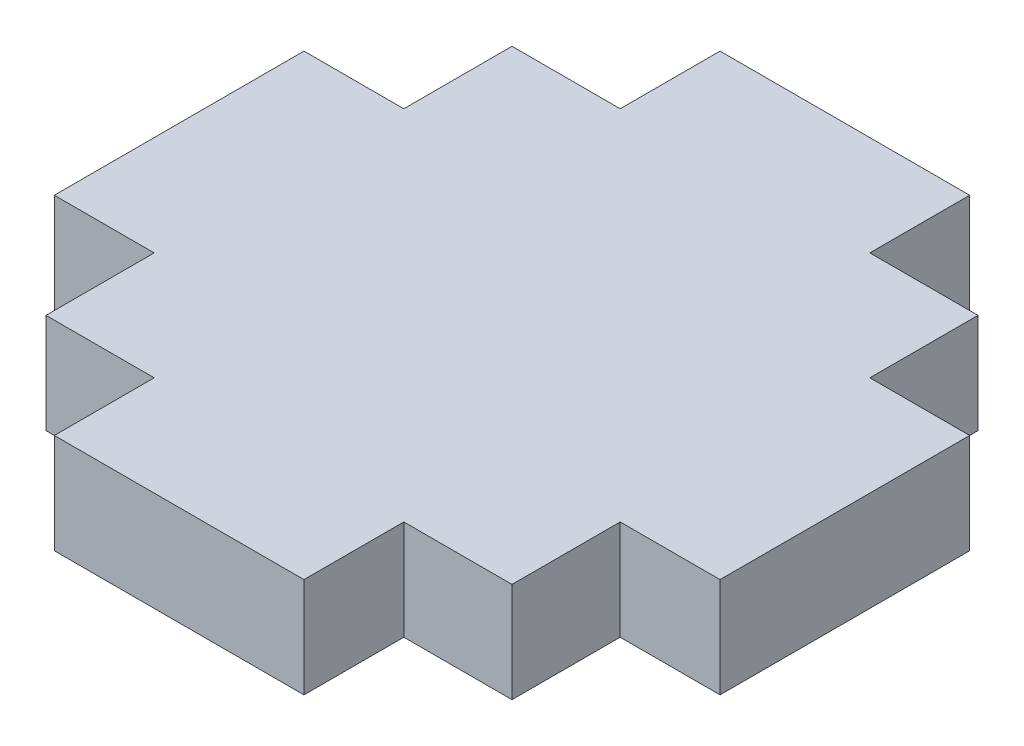
ISO-10303-21;
HEADER;
FILE_DESCRIPTION(('STEP AP214'),'2;1');
FILE_NAME('part.step','',(''),(''),'','','');
FILE_SCHEMA(('AUTOMOTIVE_DESIGN { 1 0 10303 214 1 1 1 1 }'));
ENDSEC;
DATA;
#1=APPLICATION_CONTEXT('core data for automotive mechanical design processes');
#2=APPLICATION_PROTOCOL_DEFINITION('international standard','automotive_design',2000,#1);
#3=PRODUCT_CONTEXT('',#1,'mechanical');
#4=PRODUCT('Part','Part','',(#3));
#5=PRODUCT_RELATED_PRODUCT_CATEGORY('part','',(#4));
#6=PRODUCT_DEFINITION_FORMATION('','',#4);
#7=PRODUCT_DEFINITION_CONTEXT('part definition',#1,'design');
#8=PRODUCT_DEFINITION('design','',#6,#7);
#9=PRODUCT_DEFINITION_SHAPE('','',#8);
#10=(LENGTH_UNIT() NAMED_UNIT(*) SI_UNIT(.MILLI.,.METRE.));
#11=(NAMED_UNIT(*) PLANE_ANGLE_UNIT() SI_UNIT($,.RADIAN.));
#12=(NAMED_UNIT(*) SI_UNIT($,.STERADIAN.) SOLID_ANGLE_UNIT());
#13=UNCERTAINTY_MEASURE_WITH_UNIT(LENGTH_MEASURE(1.E-05),#10,'distance_accuracy_value','');
#14=(GEOMETRIC_REPRESENTATION_CONTEXT(3) GLOBAL_UNCERTAINTY_ASSIGNED_CONTEXT((#13)) GLOBAL_UNIT_ASSIGNED_CONTEXT((#10,
#11,#12)) REPRESENTATION_CONTEXT('',''));
#15=CARTESIAN_POINT('',(0.,0.,0.));
#16=DIRECTION('',(0.,0.,1.));
#17=DIRECTION('',(1.,0.,0.));
#18=AXIS2_PLACEMENT_3D('',#15,#16,#17);
#19=CARTESIAN_POINT('',(27.5,6.,0.));
#20=DIRECTION('',(-1.,0.,0.));
#21=DIRECTION('',(0.,0.,1.));
#22=AXIS2_PLACEMENT_3D('',#19,#20,#21);
#23=PLANE('',#22);
#24=DIRECTION('',(0.,0.,-1.));
#25=VECTOR('',#24,1.);
#26=CARTESIAN_POINT('',(27.5,0.,0.));
#27=LINE('',#26,#25);
#28=CARTESIAN_POINT('',(27.5,0.,0.));
#29=VERTEX_POINT('',#28);
#30=CARTESIAN_POINT('',(27.5,0.,-5.99999999999999));
#31=VERTEX_POINT('',#30);
#32=EDGE_CURVE('E213',#29,#31,#27,.T.);
#33=ORIENTED_EDGE('',*,*,#32,.T.);
#34=DIRECTION('',(0.,-1.,0.));
#35=VECTOR('',#34,1.);
#36=CARTESIAN_POINT('',(27.5,6.,-5.99999999999999));
#37=LINE('',#36,#35);
#38=CARTESIAN_POINT('',(27.5,6.,-5.99999999999999));
#39=VERTEX_POINT('',#38);
#40=EDGE_CURVE('E11',#39,#31,#37,.T.);
#41=ORIENTED_EDGE('',*,*,#40,.F.);
#42=DIRECTION('',(0.,0.,-1.));
#43=VECTOR('',#42,1.);
#44=CARTESIAN_POINT('',(27.5,6.,0.));
#45=LINE('',#44,#43);
#46=CARTESIAN_POINT('',(27.5,6.,0.));
#47=VERTEX_POINT('',#46);
#48=EDGE_CURVE('E282',#47,#39,#45,.T.);
#49=ORIENTED_EDGE('',*,*,#48,.F.);
#50=DIRECTION('',(0.,-1.,0.));
#51=VECTOR('',#50,1.);
#52=CARTESIAN_POINT('',(27.5,6.,0.));
#53=LINE('',#52,#51);
#54=EDGE_CURVE('E209',#47,#29,#53,.T.);
#55=ORIENTED_EDGE('',*,*,#54,.T.);
#56=EDGE_LOOP('',(#33,#41,#49,#55));
#57=FACE_BOUND('',#56,.T.);
#58=ADVANCED_FACE('F41',(#57),#23,.F.);
#59=CARTESIAN_POINT('',(0.,6.,-5.99999999999996));
#60=DIRECTION('',(0.,0.,-1.));
#61=DIRECTION('',(-1.,0.,0.));
#62=AXIS2_PLACEMENT_3D('',#59,#60,#61);
#63=PLANE('',#62);
#64=DIRECTION('',(1.,0.,0.));
#65=VECTOR('',#64,1.);
#66=CARTESIAN_POINT('',(0.,0.,-5.99999999999996));
#67=LINE('',#66,#65);
#68=CARTESIAN_POINT('',(34.,0.,-6.));
#69=VERTEX_POINT('',#68);
#70=EDGE_CURVE('E217',#31,#69,#67,.T.);
#71=ORIENTED_EDGE('',*,*,#70,.T.);
#72=DIRECTION('',(0.,-1.,0.));
#73=VECTOR('',#72,1.);
#74=CARTESIAN_POINT('',(34.,6.,-6.));
#75=LINE('',#74,#73);
#76=CARTESIAN_POINT('',(34.,6.,-6.));
#77=VERTEX_POINT('',#76);
#78=EDGE_CURVE('E50',#77,#69,#75,.T.);
#79=ORIENTED_EDGE('',*,*,#78,.F.);
#80=DIRECTION('',(1.,0.,0.));
#81=VECTOR('',#80,1.);
#82=CARTESIAN_POINT('',(0.,6.,-5.99999999999996));
#83=LINE('',#82,#81);
#84=EDGE_CURVE('E133',#39,#77,#83,.T.);
#85=ORIENTED_EDGE('',*,*,#84,.F.);
#86=ORIENTED_EDGE('',*,*,#40,.T.);
#87=EDGE_LOOP('',(#71,#79,#85,#86));
#88=FACE_BOUND('',#87,.T.);
#89=ADVANCED_FACE('F423',(#88),#63,.F.);
#90=CARTESIAN_POINT('',(34.,6.,0.));
#91=DIRECTION('',(-1.,0.,0.));
#92=DIRECTION('',(0.,0.,1.));
#93=AXIS2_PLACEMENT_3D('',#90,#91,#92);
#94=PLANE('',#93);
#95=DIRECTION('',(0.,0.,-1.));
#96=VECTOR('',#95,1.);
#97=CARTESIAN_POINT('',(34.,0.,0.));
#98=LINE('',#97,#96);
#99=CARTESIAN_POINT('',(34.,0.,-12.5));
#100=VERTEX_POINT('',#99);
#101=EDGE_CURVE('E220',#69,#100,#98,.T.);
#102=ORIENTED_EDGE('',*,*,#101,.T.);
#103=DIRECTION('',(0.,-1.,0.));
#104=VECTOR('',#103,1.);
#105=CARTESIAN_POINT('',(34.,6.,-12.5));
#106=LINE('',#105,#104);
#107=CARTESIAN_POINT('',(34.,6.,-12.5));
#108=VERTEX_POINT('',#107);
#109=EDGE_CURVE('E332',#108,#100,#106,.T.);
#110=ORIENTED_EDGE('',*,*,#109,.F.);
#111=DIRECTION('',(0.,0.,-1.));
#112=VECTOR('',#111,1.);
#113=CARTESIAN_POINT('',(34.,6.,0.));
#114=LINE('',#113,#112);
#115=EDGE_CURVE('E342',#77,#108,#114,.T.);
#116=ORIENTED_EDGE('',*,*,#115,.F.);
#117=ORIENTED_EDGE('',*,*,#78,.T.);
#118=EDGE_LOOP('',(#102,#110,#116,#117));
#119=FACE_BOUND('',#118,.T.);
#120=ADVANCED_FACE('F340',(#119),#94,.F.);
#121=CARTESIAN_POINT('',(0.,6.,-12.5));
#122=DIRECTION('',(0.,0.,-1.));
#123=DIRECTION('',(-1.,0.,0.));
#124=AXIS2_PLACEMENT_3D('',#121,#122,#123);
#125=PLANE('',#124);
#126=DIRECTION('',(1.,0.,0.));
#127=VECTOR('',#126,1.);
#128=CARTESIAN_POINT('',(0.,0.,-12.5));
#129=LINE('',#128,#127);
#130=CARTESIAN_POINT('',(40.,0.,-12.5));
#131=VERTEX_POINT('',#130);
#132=EDGE_CURVE('E223',#100,#131,#129,.T.);
#133=ORIENTED_EDGE('',*,*,#132,.T.);
#134=DIRECTION('',(0.,-1.,0.));
#135=VECTOR('',#134,1.);
#136=CARTESIAN_POINT('',(40.,6.,-12.5));
#137=LINE('',#136,#135);
#138=CARTESIAN_POINT('',(40.,6.,-12.5));
#139=VERTEX_POINT('',#138);
#140=EDGE_CURVE('E328',#139,#131,#137,.T.);
#141=ORIENTED_EDGE('',*,*,#140,.F.);
#142=DIRECTION('',(1.,0.,0.));
#143=VECTOR('',#142,1.);
#144=CARTESIAN_POINT('',(0.,6.,-12.5));
#145=LINE('',#144,#143);
#146=EDGE_CURVE('E361',#108,#139,#145,.T.);
#147=ORIENTED_EDGE('',*,*,#146,.F.);
#148=ORIENTED_EDGE('',*,*,#109,.T.);
#149=EDGE_LOOP('',(#133,#141,#147,#148));
#150=FACE_BOUND('',#149,.T.);
#151=ADVANCED_FACE('F350',(#150),#125,.F.);
#152=CARTESIAN_POINT('',(40.,6.,0.));
#153=DIRECTION('',(-1.,0.,0.));
#154=DIRECTION('',(0.,0.,1.));
#155=AXIS2_PLACEMENT_3D('',#152,#153,#154);
#156=PLANE('',#155);
#157=DIRECTION('',(0.,0.,-1.));
#158=VECTOR('',#157,1.);
#159=CARTESIAN_POINT('',(40.,0.,0.));
#160=LINE('',#159,#158);
#161=CARTESIAN_POINT('',(40.,0.,-27.5));
#162=VERTEX_POINT('',#161);
#163=EDGE_CURVE('E226',#131,#162,#160,.T.);
#164=ORIENTED_EDGE('',*,*,#163,.T.);
#165=DIRECTION('',(0.,-1.,0.));
#166=VECTOR('',#165,1.);
#167=CARTESIAN_POINT('',(40.,6.,-27.5));
#168=LINE('',#167,#166);
#169=CARTESIAN_POINT('',(40.,6.,-27.5));
#170=VERTEX_POINT('',#169);
#171=EDGE_CURVE('E325',#170,#162,#168,.T.);
#172=ORIENTED_EDGE('',*,*,#171,.F.);
#173=DIRECTION('',(0.,0.,-1.));
#174=VECTOR('',#173,1.);
#175=CARTESIAN_POINT('',(40.,6.,0.));
#176=LINE('',#175,#174);
#177=EDGE_CURVE('E356',#139,#170,#176,.T.);
#178=ORIENTED_EDGE('',*,*,#177,.F.);
#179=ORIENTED_EDGE('',*,*,#140,.T.);
#180=EDGE_LOOP('',(#164,#172,#178,#179));
#181=FACE_BOUND('',#180,.T.);
#182=ADVANCED_FACE('F354',(#181),#156,.F.);
#183=CARTESIAN_POINT('',(0.,6.,-27.5));
#184=DIRECTION('',(0.,0.,-1.));
#185=DIRECTION('',(-1.,0.,0.));
#186=AXIS2_PLACEMENT_3D('',#183,#184,#185);
#187=PLANE('',#186);
#188=DIRECTION('',(1.,0.,0.));
#189=VECTOR('',#188,1.);
#190=CARTESIAN_POINT('',(0.,0.,-27.5));
#191=LINE('',#190,#189);
#192=CARTESIAN_POINT('',(34.,0.,-27.5));
#193=VERTEX_POINT('',#192);
#194=EDGE_CURVE('E230',#193,#162,#191,.T.);
#195=ORIENTED_EDGE('',*,*,#194,.F.);
#196=DIRECTION('',(0.,-1.,0.));
#197=VECTOR('',#196,1.);
#198=CARTESIAN_POINT('',(34.,6.,-27.5));
#199=LINE('',#198,#197);
#200=CARTESIAN_POINT('',(34.,6.,-27.5));
#201=VERTEX_POINT('',#200);
#202=EDGE_CURVE('E322',#201,#193,#199,.T.);
#203=ORIENTED_EDGE('',*,*,#202,.F.);
#204=DIRECTION('',(1.,0.,0.));
#205=VECTOR('',#204,1.);
#206=CARTESIAN_POINT('',(0.,6.,-27.5));
#207=LINE('',#206,#205);
#208=EDGE_CURVE('E360',#201,#170,#207,.T.);
#209=ORIENTED_EDGE('',*,*,#208,.T.);
#210=ORIENTED_EDGE('',*,*,#171,.T.);
#211=EDGE_LOOP('',(#195,#203,#209,#210));
#212=FACE_BOUND('',#211,.T.);
#213=ADVANCED_FACE('F436',(#212),#187,.T.);
#214=CARTESIAN_POINT('',(34.,6.,0.));
#215=DIRECTION('',(1.,0.,0.));
#216=DIRECTION('',(0.,0.,-1.));
#217=AXIS2_PLACEMENT_3D('',#214,#215,#216);
#218=PLANE('',#217);
#219=DIRECTION('',(0.,0.,1.));
#220=VECTOR('',#219,1.);
#221=CARTESIAN_POINT('',(34.,0.,0.));
#222=LINE('',#221,#220);
#223=CARTESIAN_POINT('',(34.,0.,-34.));
#224=VERTEX_POINT('',#223);
#225=EDGE_CURVE('E234',#224,#193,#222,.T.);
#226=ORIENTED_EDGE('',*,*,#225,.F.);
#227=DIRECTION('',(0.,-1.,0.));
#228=VECTOR('',#227,1.);
#229=CARTESIAN_POINT('',(34.,6.,-34.));
#230=LINE('',#229,#228);
#231=CARTESIAN_POINT('',(34.,6.,-34.));
#232=VERTEX_POINT('',#231);
#233=EDGE_CURVE('E319',#232,#224,#230,.T.);
#234=ORIENTED_EDGE('',*,*,#233,.F.);
#235=DIRECTION('',(0.,0.,1.));
#236=VECTOR('',#235,1.);
#237=CARTESIAN_POINT('',(34.,6.,0.));
#238=LINE('',#237,#236);
#239=EDGE_CURVE('E365',#232,#201,#238,.T.);
#240=ORIENTED_EDGE('',*,*,#239,.T.);
#241=ORIENTED_EDGE('',*,*,#202,.T.);
#242=EDGE_LOOP('',(#226,#234,#240,#241));
#243=FACE_BOUND('',#242,.T.);
#244=ADVANCED_FACE('F439',(#243),#218,.T.);
#245=CARTESIAN_POINT('',(0.,6.,-34.));
#246=DIRECTION('',(0.,0.,-1.));
#247=DIRECTION('',(-1.,0.,0.));
#248=AXIS2_PLACEMENT_3D('',#245,#246,#247);
#249=PLANE('',#248);
#250=DIRECTION('',(1.,0.,0.));
#251=VECTOR('',#250,1.);
#252=CARTESIAN_POINT('',(0.,0.,-34.));
#253=LINE('',#252,#251);
#254=CARTESIAN_POINT('',(27.5,0.,-34.));
#255=VERTEX_POINT('',#254);
#256=EDGE_CURVE('E238',#255,#224,#253,.T.);
#257=ORIENTED_EDGE('',*,*,#256,.F.);
#258=DIRECTION('',(0.,-1.,0.));
#259=VECTOR('',#258,1.);
#260=CARTESIAN_POINT('',(27.5,6.,-34.));
#261=LINE('',#260,#259);
#262=CARTESIAN_POINT('',(27.5,6.,-34.));
#263=VERTEX_POINT('',#262);
#264=EDGE_CURVE('E316',#263,#255,#261,.T.);
#265=ORIENTED_EDGE('',*,*,#264,.F.);
#266=DIRECTION('',(1.,0.,0.));
#267=VECTOR('',#266,1.);
#268=CARTESIAN_POINT('',(0.,6.,-34.));
#269=LINE('',#268,#267);
#270=EDGE_CURVE('E373',#263,#232,#269,.T.);
#271=ORIENTED_EDGE('',*,*,#270,.T.);
#272=ORIENTED_EDGE('',*,*,#233,.T.);
#273=EDGE_LOOP('',(#257,#265,#271,#272));
#274=FACE_BOUND('',#273,.T.);
#275=ADVANCED_FACE('F443',(#274),#249,.T.);
#276=CARTESIAN_POINT('',(27.5,6.,0.));
#277=DIRECTION('',(1.,0.,0.));
#278=DIRECTION('',(0.,0.,-1.));
#279=AXIS2_PLACEMENT_3D('',#276,#277,#278);
#280=PLANE('',#279);
#281=DIRECTION('',(0.,0.,1.));
#282=VECTOR('',#281,1.);
#283=CARTESIAN_POINT('',(27.5,0.,0.));
#284=LINE('',#283,#282);
#285=CARTESIAN_POINT('',(27.5,0.,-40.));
#286=VERTEX_POINT('',#285);
#287=EDGE_CURVE('E242',#286,#255,#284,.T.);
#288=ORIENTED_EDGE('',*,*,#287,.F.);
#289=DIRECTION('',(0.,-1.,0.));
#290=VECTOR('',#289,1.);
#291=CARTESIAN_POINT('',(27.5,6.,-40.));
#292=LINE('',#291,#290);
#293=CARTESIAN_POINT('',(27.5,6.,-40.));
#294=VERTEX_POINT('',#293);
#295=EDGE_CURVE('E313',#294,#286,#292,.T.);
#296=ORIENTED_EDGE('',*,*,#295,.F.);
#297=DIRECTION('',(0.,0.,1.));
#298=VECTOR('',#297,1.);
#299=CARTESIAN_POINT('',(27.5,6.,0.));
#300=LINE('',#299,#298);
#301=EDGE_CURVE('E377',#294,#263,#300,.T.);
#302=ORIENTED_EDGE('',*,*,#301,.T.);
#303=ORIENTED_EDGE('',*,*,#264,.T.);
#304=EDGE_LOOP('',(#288,#296,#302,#303));
#305=FACE_BOUND('',#304,.T.);
#306=ADVANCED_FACE('F447',(#305),#280,.T.);
#307=CARTESIAN_POINT('',(0.,6.,-40.));
#308=DIRECTION('',(0.,0.,-1.));
#309=DIRECTION('',(-1.,0.,0.));
#310=AXIS2_PLACEMENT_3D('',#307,#308,#309);
#311=PLANE('',#310);
#312=DIRECTION('',(1.,0.,0.));
#313=VECTOR('',#312,1.);
#314=CARTESIAN_POINT('',(0.,0.,-40.));
#315=LINE('',#314,#313);
#316=CARTESIAN_POINT('',(12.5,0.,-40.));
#317=VERTEX_POINT('',#316);
#318=EDGE_CURVE('E246',#317,#286,#315,.T.);
#319=ORIENTED_EDGE('',*,*,#318,.F.);
#320=DIRECTION('',(0.,-1.,0.));
#321=VECTOR('',#320,1.);
#322=CARTESIAN_POINT('',(12.5,6.,-40.));
#323=LINE('',#322,#321);
#324=CARTESIAN_POINT('',(12.5,6.,-40.));
#325=VERTEX_POINT('',#324);
#326=EDGE_CURVE('E310',#325,#317,#323,.T.);
#327=ORIENTED_EDGE('',*,*,#326,.F.);
#328=DIRECTION('',(1.,0.,0.));
#329=VECTOR('',#328,1.);
#330=CARTESIAN_POINT('',(0.,6.,-40.));
#331=LINE('',#330,#329);
#332=EDGE_CURVE('E381',#325,#294,#331,.T.);
#333=ORIENTED_EDGE('',*,*,#332,.T.);
#334=ORIENTED_EDGE('',*,*,#295,.T.);
#335=EDGE_LOOP('',(#319,#327,#333,#334));
#336=FACE_BOUND('',#335,.T.);
#337=ADVANCED_FACE('F451',(#336),#311,.T.);
#338=CARTESIAN_POINT('',(12.5,6.,0.));
#339=DIRECTION('',(1.,0.,0.));
#340=DIRECTION('',(0.,0.,-1.));
#341=AXIS2_PLACEMENT_3D('',#338,#339,#340);
#342=PLANE('',#341);
#343=DIRECTION('',(0.,0.,1.));
#344=VECTOR('',#343,1.);
#345=CARTESIAN_POINT('',(12.5,0.,0.));
#346=LINE('',#345,#344);
#347=CARTESIAN_POINT('',(12.5,0.,-34.));
#348=VERTEX_POINT('',#347);
#349=EDGE_CURVE('E250',#317,#348,#346,.T.);
#350=ORIENTED_EDGE('',*,*,#349,.T.);
#351=DIRECTION('',(0.,-1.,0.));
#352=VECTOR('',#351,1.);
#353=CARTESIAN_POINT('',(12.5,6.,-34.));
#354=LINE('',#353,#352);
#355=CARTESIAN_POINT('',(12.5,6.,-34.));
#356=VERTEX_POINT('',#355);
#357=EDGE_CURVE('E306',#356,#348,#354,.T.);
#358=ORIENTED_EDGE('',*,*,#357,.F.);
#359=DIRECTION('',(0.,0.,1.));
#360=VECTOR('',#359,1.);
#361=CARTESIAN_POINT('',(12.5,6.,0.));
#362=LINE('',#361,#360);
#363=EDGE_CURVE('E385',#325,#356,#362,.T.);
#364=ORIENTED_EDGE('',*,*,#363,.F.);
#365=ORIENTED_EDGE('',*,*,#326,.T.);
#366=EDGE_LOOP('',(#350,#358,#364,#365));
#367=FACE_BOUND('',#366,.T.);
#368=ADVANCED_FACE('F455',(#367),#342,.F.);
#369=CARTESIAN_POINT('',(0.,6.,-34.));
#370=DIRECTION('',(0.,0.,1.));
#371=DIRECTION('',(1.,0.,0.));
#372=AXIS2_PLACEMENT_3D('',#369,#370,#371);
#373=PLANE('',#372);
#374=DIRECTION('',(-1.,0.,0.));
#375=VECTOR('',#374,1.);
#376=CARTESIAN_POINT('',(0.,0.,-34.));
#377=LINE('',#376,#375);
#378=CARTESIAN_POINT('',(6.,0.,-34.));
#379=VERTEX_POINT('',#378);
#380=EDGE_CURVE('E253',#348,#379,#377,.T.);
#381=ORIENTED_EDGE('',*,*,#380,.T.);
#382=DIRECTION('',(0.,-1.,0.));
#383=VECTOR('',#382,1.);
#384=CARTESIAN_POINT('',(6.,6.,-34.));
#385=LINE('',#384,#383);
#386=CARTESIAN_POINT('',(6.,6.,-34.));
#387=VERTEX_POINT('',#386);
#388=EDGE_CURVE('E302',#387,#379,#385,.T.);
#389=ORIENTED_EDGE('',*,*,#388,.F.);
#390=DIRECTION('',(-1.,0.,0.));
#391=VECTOR('',#390,1.);
#392=CARTESIAN_POINT('',(0.,6.,-34.));
#393=LINE('',#392,#391);
#394=EDGE_CURVE('E388',#356,#387,#393,.T.);
#395=ORIENTED_EDGE('',*,*,#394,.F.);
#396=ORIENTED_EDGE('',*,*,#357,.T.);
#397=EDGE_LOOP('',(#381,#389,#395,#396));
#398=FACE_BOUND('',#397,.T.);
#399=ADVANCED_FACE('F459',(#398),#373,.F.);
#400=CARTESIAN_POINT('',(6.,6.,0.));
#401=DIRECTION('',(1.,0.,0.));
#402=DIRECTION('',(0.,0.,-1.));
#403=AXIS2_PLACEMENT_3D('',#400,#401,#402);
#404=PLANE('',#403);
#405=DIRECTION('',(0.,0.,1.));
#406=VECTOR('',#405,1.);
#407=CARTESIAN_POINT('',(6.,0.,0.));
#408=LINE('',#407,#406);
#409=CARTESIAN_POINT('',(6.,0.,-27.5));
#410=VERTEX_POINT('',#409);
#411=EDGE_CURVE('E256',#379,#410,#408,.T.);
#412=ORIENTED_EDGE('',*,*,#411,.T.);
#413=DIRECTION('',(0.,-1.,0.));
#414=VECTOR('',#413,1.);
#415=CARTESIAN_POINT('',(6.,6.,-27.5));
#416=LINE('',#415,#414);
#417=CARTESIAN_POINT('',(6.,6.,-27.5));
#418=VERTEX_POINT('',#417);
#419=EDGE_CURVE('E298',#418,#410,#416,.T.);
#420=ORIENTED_EDGE('',*,*,#419,.F.);
#421=DIRECTION('',(0.,0.,1.));
#422=VECTOR('',#421,1.);
#423=CARTESIAN_POINT('',(6.,6.,0.));
#424=LINE('',#423,#422);
#425=EDGE_CURVE('E391',#387,#418,#424,.T.);
#426=ORIENTED_EDGE('',*,*,#425,.F.);
#427=ORIENTED_EDGE('',*,*,#388,.T.);
#428=EDGE_LOOP('',(#412,#420,#426,#427));
#429=FACE_BOUND('',#428,.T.);
#430=ADVANCED_FACE('F463',(#429),#404,.F.);
#431=CARTESIAN_POINT('',(0.,6.,-27.5));
#432=DIRECTION('',(0.,0.,1.));
#433=DIRECTION('',(1.,0.,0.));
#434=AXIS2_PLACEMENT_3D('',#431,#432,#433);
#435=PLANE('',#434);
#436=DIRECTION('',(-1.,0.,0.));
#437=VECTOR('',#436,1.);
#438=CARTESIAN_POINT('',(0.,0.,-27.5));
#439=LINE('',#438,#437);
#440=CARTESIAN_POINT('',(0.,0.,-27.5));
#441=VERTEX_POINT('',#440);
#442=EDGE_CURVE('E259',#410,#441,#439,.T.);
#443=ORIENTED_EDGE('',*,*,#442,.T.);
#444=DIRECTION('',(0.,-1.,0.));
#445=VECTOR('',#444,1.);
#446=CARTESIAN_POINT('',(0.,6.,-27.5));
#447=LINE('',#446,#445);
#448=CARTESIAN_POINT('',(0.,6.,-27.5));
#449=VERTEX_POINT('',#448);
#450=EDGE_CURVE('E295',#449,#441,#447,.T.);
#451=ORIENTED_EDGE('',*,*,#450,.F.);
#452=DIRECTION('',(-1.,0.,0.));
#453=VECTOR('',#452,1.);
#454=CARTESIAN_POINT('',(0.,6.,-27.5));
#455=LINE('',#454,#453);
#456=EDGE_CURVE('E394',#418,#449,#455,.T.);
#457=ORIENTED_EDGE('',*,*,#456,.F.);
#458=ORIENTED_EDGE('',*,*,#419,.T.);
#459=EDGE_LOOP('',(#443,#451,#457,#458));
#460=FACE_BOUND('',#459,.T.);
#461=ADVANCED_FACE('F467',(#460),#435,.F.);
#462=CARTESIAN_POINT('',(0.,6.,0.));
#463=DIRECTION('',(-1.,0.,0.));
#464=DIRECTION('',(0.,0.,1.));
#465=AXIS2_PLACEMENT_3D('',#462,#463,#464);
#466=PLANE('',#465);
#467=DIRECTION('',(0.,0.,-1.));
#468=VECTOR('',#467,1.);
#469=CARTESIAN_POINT('',(0.,0.,0.));
#470=LINE('',#469,#468);
#471=CARTESIAN_POINT('',(0.,0.,-12.5));
#472=VERTEX_POINT('',#471);
#473=EDGE_CURVE('E263',#472,#441,#470,.T.);
#474=ORIENTED_EDGE('',*,*,#473,.F.);
#475=DIRECTION('',(0.,-1.,0.));
#476=VECTOR('',#475,1.);
#477=CARTESIAN_POINT('',(0.,6.,-12.5));
#478=LINE('',#477,#476);
#479=CARTESIAN_POINT('',(0.,6.,-12.5));
#480=VERTEX_POINT('',#479);
#481=EDGE_CURVE('E292',#480,#472,#478,.T.);
#482=ORIENTED_EDGE('',*,*,#481,.F.);
#483=DIRECTION('',(0.,0.,-1.));
#484=VECTOR('',#483,1.);
#485=CARTESIAN_POINT('',(0.,6.,0.));
#486=LINE('',#485,#484);
#487=EDGE_CURVE('E397',#480,#449,#486,.T.);
#488=ORIENTED_EDGE('',*,*,#487,.T.);
#489=ORIENTED_EDGE('',*,*,#450,.T.);
#490=EDGE_LOOP('',(#474,#482,#488,#489));
#491=FACE_BOUND('',#490,.T.);
#492=ADVANCED_FACE('F471',(#491),#466,.T.);
#493=CARTESIAN_POINT('',(0.,6.,-12.5));
#494=DIRECTION('',(0.,0.,1.));
#495=DIRECTION('',(1.,0.,0.));
#496=AXIS2_PLACEMENT_3D('',#493,#494,#495);
#497=PLANE('',#496);
#498=DIRECTION('',(-1.,0.,0.));
#499=VECTOR('',#498,1.);
#500=CARTESIAN_POINT('',(0.,0.,-12.5));
#501=LINE('',#500,#499);
#502=CARTESIAN_POINT('',(6.,0.,-12.5));
#503=VERTEX_POINT('',#502);
#504=EDGE_CURVE('E267',#503,#472,#501,.T.);
#505=ORIENTED_EDGE('',*,*,#504,.F.);
#506=DIRECTION('',(0.,-1.,0.));
#507=VECTOR('',#506,1.);
#508=CARTESIAN_POINT('',(6.,6.,-12.5));
#509=LINE('',#508,#507);
#510=CARTESIAN_POINT('',(6.,6.,-12.5));
#511=VERTEX_POINT('',#510);
#512=EDGE_CURVE('E289',#511,#503,#509,.T.);
#513=ORIENTED_EDGE('',*,*,#512,.F.);
#514=DIRECTION('',(-1.,0.,0.));
#515=VECTOR('',#514,1.);
#516=CARTESIAN_POINT('',(0.,6.,-12.5));
#517=LINE('',#516,#515);
#518=EDGE_CURVE('E401',#511,#480,#517,.T.);
#519=ORIENTED_EDGE('',*,*,#518,.T.);
#520=ORIENTED_EDGE('',*,*,#481,.T.);
#521=EDGE_LOOP('',(#505,#513,#519,#520));
#522=FACE_BOUND('',#521,.T.);
#523=ADVANCED_FACE('F475',(#522),#497,.T.);
#524=CARTESIAN_POINT('',(6.,6.,0.));
#525=DIRECTION('',(-1.,0.,0.));
#526=DIRECTION('',(0.,0.,1.));
#527=AXIS2_PLACEMENT_3D('',#524,#525,#526);
#528=PLANE('',#527);
#529=DIRECTION('',(0.,0.,-1.));
#530=VECTOR('',#529,1.);
#531=CARTESIAN_POINT('',(6.,0.,0.));
#532=LINE('',#531,#530);
#533=CARTESIAN_POINT('',(6.,0.,-6.));
#534=VERTEX_POINT('',#533);
#535=EDGE_CURVE('E271',#534,#503,#532,.T.);
#536=ORIENTED_EDGE('',*,*,#535,.F.);
#537=DIRECTION('',(0.,-1.,0.));
#538=VECTOR('',#537,1.);
#539=CARTESIAN_POINT('',(6.,6.,-6.));
#540=LINE('',#539,#538);
#541=CARTESIAN_POINT('',(6.,6.,-6.));
#542=VERTEX_POINT('',#541);
#543=EDGE_CURVE('E195',#542,#534,#540,.T.);
#544=ORIENTED_EDGE('',*,*,#543,.F.);
#545=DIRECTION('',(0.,0.,-1.));
#546=VECTOR('',#545,1.);
#547=CARTESIAN_POINT('',(6.,6.,0.));
#548=LINE('',#547,#546);
#549=EDGE_CURVE('E202',#542,#511,#548,.T.);
#550=ORIENTED_EDGE('',*,*,#549,.T.);
#551=ORIENTED_EDGE('',*,*,#512,.T.);
#552=EDGE_LOOP('',(#536,#544,#550,#551));
#553=FACE_BOUND('',#552,.T.);
#554=ADVANCED_FACE('F407',(#553),#528,.T.);
#555=CARTESIAN_POINT('',(0.,6.,-6.));
#556=DIRECTION('',(0.,0.,1.));
#557=DIRECTION('',(1.,0.,0.));
#558=AXIS2_PLACEMENT_3D('',#555,#556,#557);
#559=PLANE('',#558);
#560=DIRECTION('',(-1.,0.,0.));
#561=VECTOR('',#560,1.);
#562=CARTESIAN_POINT('',(0.,0.,-6.));
#563=LINE('',#562,#561);
#564=CARTESIAN_POINT('',(12.5,0.,-5.99999999999999));
#565=VERTEX_POINT('',#564);
#566=EDGE_CURVE('E189',#565,#534,#563,.T.);
#567=ORIENTED_EDGE('',*,*,#566,.F.);
#568=DIRECTION('',(0.,-1.,0.));
#569=VECTOR('',#568,1.);
#570=CARTESIAN_POINT('',(12.5,6.,-5.99999999999999));
#571=LINE('',#570,#569);
#572=CARTESIAN_POINT('',(12.5,6.,-5.99999999999999));
#573=VERTEX_POINT('',#572);
#574=EDGE_CURVE('E184',#573,#565,#571,.T.);
#575=ORIENTED_EDGE('',*,*,#574,.F.);
#576=DIRECTION('',(-1.,0.,0.));
#577=VECTOR('',#576,1.);
#578=CARTESIAN_POINT('',(0.,6.,-6.));
#579=LINE('',#578,#577);
#580=EDGE_CURVE('E187',#573,#542,#579,.T.);
#581=ORIENTED_EDGE('',*,*,#580,.T.);
#582=ORIENTED_EDGE('',*,*,#543,.T.);
#583=EDGE_LOOP('',(#567,#575,#581,#582));
#584=FACE_BOUND('',#583,.T.);
#585=ADVANCED_FACE('F186',(#584),#559,.T.);
#586=CARTESIAN_POINT('',(12.5,6.,0.));
#587=DIRECTION('',(-1.,0.,0.));
#588=DIRECTION('',(0.,0.,1.));
#589=AXIS2_PLACEMENT_3D('',#586,#587,#588);
#590=PLANE('',#589);
#591=DIRECTION('',(0.,0.,-1.));
#592=VECTOR('',#591,1.);
#593=CARTESIAN_POINT('',(12.5,0.,0.));
#594=LINE('',#593,#592);
#595=CARTESIAN_POINT('',(12.5,0.,0.));
#596=VERTEX_POINT('',#595);
#597=EDGE_CURVE('E277',#596,#565,#594,.T.);
#598=ORIENTED_EDGE('',*,*,#597,.F.);
#599=DIRECTION('',(0.,-1.,0.));
#600=VECTOR('',#599,1.);
#601=CARTESIAN_POINT('',(12.5,6.,0.));
#602=LINE('',#601,#600);
#603=CARTESIAN_POINT('',(12.5,6.,0.));
#604=VERTEX_POINT('',#603);
#605=EDGE_CURVE('E122',#604,#596,#602,.T.);
#606=ORIENTED_EDGE('',*,*,#605,.F.);
#607=DIRECTION('',(0.,0.,-1.));
#608=VECTOR('',#607,1.);
#609=CARTESIAN_POINT('',(12.5,6.,0.));
#610=LINE('',#609,#608);
#611=EDGE_CURVE('E199',#604,#573,#610,.T.);
#612=ORIENTED_EDGE('',*,*,#611,.T.);
#613=ORIENTED_EDGE('',*,*,#574,.T.);
#614=EDGE_LOOP('',(#598,#606,#612,#613));
#615=FACE_BOUND('',#614,.T.);
#616=ADVANCED_FACE('F205',(#615),#590,.T.);
#617=CARTESIAN_POINT('',(0.,6.,0.));
#618=DIRECTION('',(0.,0.,-1.));
#619=DIRECTION('',(-1.,0.,0.));
#620=AXIS2_PLACEMENT_3D('',#617,#618,#619);
#621=PLANE('',#620);
#622=DIRECTION('',(1.,0.,0.));
#623=VECTOR('',#622,1.);
#624=CARTESIAN_POINT('',(0.,0.,0.));
#625=LINE('',#624,#623);
#626=EDGE_CURVE('E125',#596,#29,#625,.T.);
#627=ORIENTED_EDGE('',*,*,#626,.T.);
#628=ORIENTED_EDGE('',*,*,#54,.F.);
#629=DIRECTION('',(1.,0.,0.));
#630=VECTOR('',#629,1.);
#631=CARTESIAN_POINT('',(0.,6.,0.));
#632=LINE('',#631,#630);
#633=EDGE_CURVE('E58',#604,#47,#632,.T.);
#634=ORIENTED_EDGE('',*,*,#633,.F.);
#635=ORIENTED_EDGE('',*,*,#605,.T.);
#636=EDGE_LOOP('',(#627,#628,#634,#635));
#637=FACE_BOUND('',#636,.T.);
#638=ADVANCED_FACE('F412',(#637),#621,.F.);
#639=CARTESIAN_POINT('',(0.,6.,0.));
#640=DIRECTION('',(0.,1.,0.));
#641=DIRECTION('',(0.,0.,1.));
#642=AXIS2_PLACEMENT_3D('',#639,#640,#641);
#643=PLANE('',#642);
#644=ORIENTED_EDGE('',*,*,#48,.T.);
#645=ORIENTED_EDGE('',*,*,#84,.T.);
#646=ORIENTED_EDGE('',*,*,#115,.T.);
#647=ORIENTED_EDGE('',*,*,#146,.T.);
#648=ORIENTED_EDGE('',*,*,#177,.T.);
#649=ORIENTED_EDGE('',*,*,#208,.F.);
#650=ORIENTED_EDGE('',*,*,#239,.F.);
#651=ORIENTED_EDGE('',*,*,#270,.F.);
#652=ORIENTED_EDGE('',*,*,#301,.F.);
#653=ORIENTED_EDGE('',*,*,#332,.F.);
#654=ORIENTED_EDGE('',*,*,#363,.T.);
#655=ORIENTED_EDGE('',*,*,#394,.T.);
#656=ORIENTED_EDGE('',*,*,#425,.T.);
#657=ORIENTED_EDGE('',*,*,#456,.T.);
#658=ORIENTED_EDGE('',*,*,#487,.F.);
#659=ORIENTED_EDGE('',*,*,#518,.F.);
#660=ORIENTED_EDGE('',*,*,#549,.F.);
#661=ORIENTED_EDGE('',*,*,#580,.F.);
#662=ORIENTED_EDGE('',*,*,#611,.F.);
#663=ORIENTED_EDGE('',*,*,#633,.T.);
#664=EDGE_LOOP('',(#644,#645,#646,#647,#648,#649,#650,#651,#652,#653,#654,#655,#656,#657,#658,
#659,#660,#661,#662,#663));
#665=FACE_BOUND('',#664,.T.);
#666=ADVANCED_FACE('F198',(#665),#643,.T.);
#667=CARTESIAN_POINT('',(0.,0.,0.));
#668=DIRECTION('',(0.,1.,0.));
#669=DIRECTION('',(0.,0.,1.));
#670=AXIS2_PLACEMENT_3D('',#667,#668,#669);
#671=PLANE('',#670);
#672=ORIENTED_EDGE('',*,*,#32,.F.);
#673=ORIENTED_EDGE('',*,*,#626,.F.);
#674=ORIENTED_EDGE('',*,*,#597,.T.);
#675=ORIENTED_EDGE('',*,*,#566,.T.);
#676=ORIENTED_EDGE('',*,*,#535,.T.);
#677=ORIENTED_EDGE('',*,*,#504,.T.);
#678=ORIENTED_EDGE('',*,*,#473,.T.);
#679=ORIENTED_EDGE('',*,*,#442,.F.);
#680=ORIENTED_EDGE('',*,*,#411,.F.);
#681=ORIENTED_EDGE('',*,*,#380,.F.);
#682=ORIENTED_EDGE('',*,*,#349,.F.);
#683=ORIENTED_EDGE('',*,*,#318,.T.);
#684=ORIENTED_EDGE('',*,*,#287,.T.);
#685=ORIENTED_EDGE('',*,*,#256,.T.);
#686=ORIENTED_EDGE('',*,*,#225,.T.);
#687=ORIENTED_EDGE('',*,*,#194,.T.);
#688=ORIENTED_EDGE('',*,*,#163,.F.);
#689=ORIENTED_EDGE('',*,*,#132,.F.);
#690=ORIENTED_EDGE('',*,*,#101,.F.);
#691=ORIENTED_EDGE('',*,*,#70,.F.);
#692=EDGE_LOOP('',(#672,#673,#674,#675,#676,#677,#678,#679,#680,#681,#682,#683,#684,#685,#686,
#687,#688,#689,#690,#691));
#693=FACE_BOUND('',#692,.T.);
#694=ADVANCED_FACE('F346',(#693),#671,.F.);
#695=CLOSED_SHELL('',(#58,#89,#120,#151,#182,#213,#244,#275,#306,#337,#368,#399,#430,#461,#492,
#523,#554,#585,#616,#638,#666,#694));
#696=MANIFOLD_SOLID_BREP('B2',#695);
#697=ADVANCED_BREP_SHAPE_REPRESENTATION('',(#18,#696),#14);
#698=SHAPE_DEFINITION_REPRESENTATION(#9,#697);
ENDSEC;
END-ISO-10303-21;
